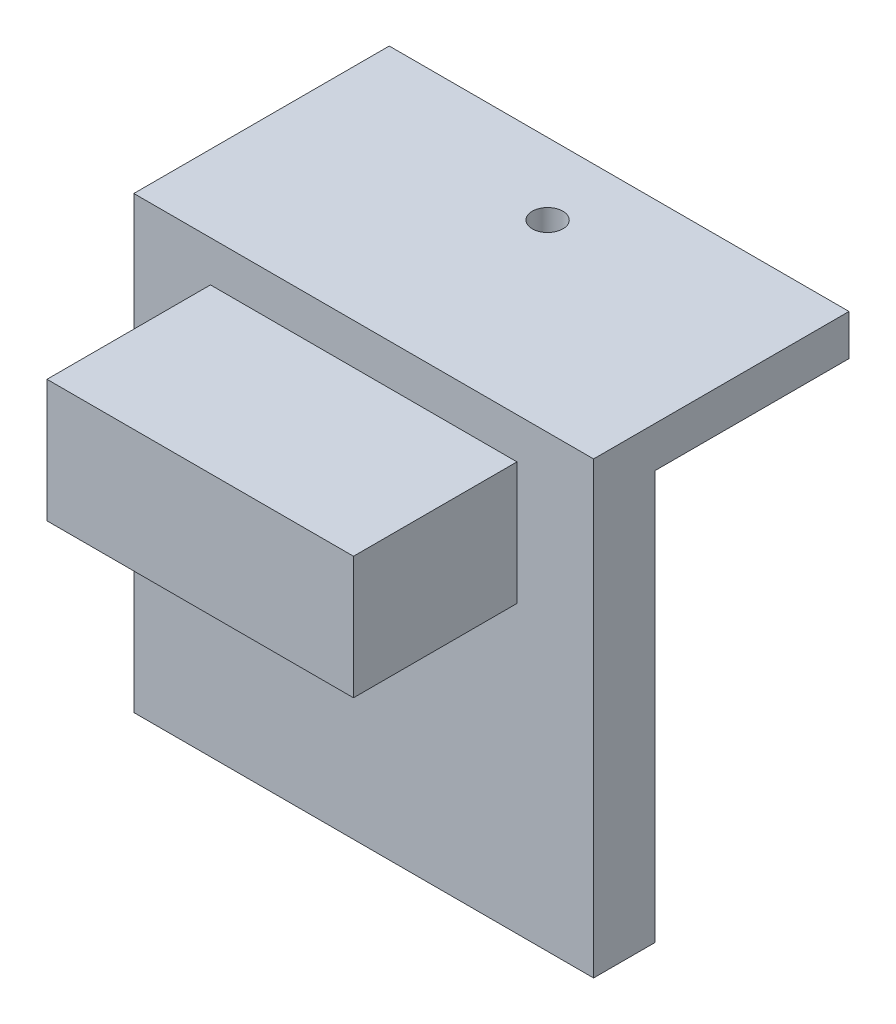
ISO-10303-21;
HEADER;
FILE_DESCRIPTION(('STEP AP214'),'2;1');
FILE_NAME('part.step','',(''),(''),'','','');
FILE_SCHEMA(('AUTOMOTIVE_DESIGN { 1 0 10303 214 1 1 1 1 }'));
ENDSEC;
DATA;
#1=APPLICATION_CONTEXT('core data for automotive mechanical design processes');
#2=APPLICATION_PROTOCOL_DEFINITION('international standard','automotive_design',2000,#1);
#3=PRODUCT_CONTEXT('',#1,'mechanical');
#4=PRODUCT('Part','Part','',(#3));
#5=PRODUCT_RELATED_PRODUCT_CATEGORY('part','',(#4));
#6=PRODUCT_DEFINITION_FORMATION('','',#4);
#7=PRODUCT_DEFINITION_CONTEXT('part definition',#1,'design');
#8=PRODUCT_DEFINITION('design','',#6,#7);
#9=PRODUCT_DEFINITION_SHAPE('','',#8);
#10=(LENGTH_UNIT() NAMED_UNIT(*) SI_UNIT(.MILLI.,.METRE.));
#11=(NAMED_UNIT(*) PLANE_ANGLE_UNIT() SI_UNIT($,.RADIAN.));
#12=(NAMED_UNIT(*) SI_UNIT($,.STERADIAN.) SOLID_ANGLE_UNIT());
#13=UNCERTAINTY_MEASURE_WITH_UNIT(LENGTH_MEASURE(1.E-05),#10,'distance_accuracy_value','');
#14=(GEOMETRIC_REPRESENTATION_CONTEXT(3) GLOBAL_UNCERTAINTY_ASSIGNED_CONTEXT((#13)) GLOBAL_UNIT_ASSIGNED_CONTEXT((#10,
#11,#12)) REPRESENTATION_CONTEXT('',''));
#15=CARTESIAN_POINT('',(0.,0.,0.));
#16=DIRECTION('',(0.,0.,1.));
#17=DIRECTION('',(1.,0.,0.));
#18=AXIS2_PLACEMENT_3D('',#15,#16,#17);
#19=CARTESIAN_POINT('',(-22.5,20.,6.));
#20=DIRECTION('',(0.,-1.,0.));
#21=DIRECTION('',(0.,0.,-1.));
#22=AXIS2_PLACEMENT_3D('',#19,#20,#21);
#23=PLANE('',#22);
#24=DIRECTION('',(1.,0.,0.));
#25=VECTOR('',#24,1.);
#26=CARTESIAN_POINT('',(-22.5,20.,6.));
#27=LINE('',#26,#25);
#28=CARTESIAN_POINT('',(-15.,20.,6.));
#29=VERTEX_POINT('',#28);
#30=CARTESIAN_POINT('',(15.,20.,6.));
#31=VERTEX_POINT('',#30);
#32=EDGE_CURVE('E11',#29,#31,#27,.T.);
#33=ORIENTED_EDGE('',*,*,#32,.F.);
#34=DIRECTION('',(0.,0.,-1.));
#35=VECTOR('',#34,1.);
#36=CARTESIAN_POINT('',(-15.,20.,22.));
#37=LINE('',#36,#35);
#38=CARTESIAN_POINT('',(-15.,20.,22.));
#39=VERTEX_POINT('',#38);
#40=EDGE_CURVE('E181',#39,#29,#37,.T.);
#41=ORIENTED_EDGE('',*,*,#40,.F.);
#42=DIRECTION('',(-1.,0.,0.));
#43=VECTOR('',#42,1.);
#44=CARTESIAN_POINT('',(-15.,20.,22.));
#45=LINE('',#44,#43);
#46=CARTESIAN_POINT('',(15.,20.,22.));
#47=VERTEX_POINT('',#46);
#48=EDGE_CURVE('E184',#47,#39,#45,.T.);
#49=ORIENTED_EDGE('',*,*,#48,.F.);
#50=DIRECTION('',(0.,0.,-1.));
#51=VECTOR('',#50,1.);
#52=CARTESIAN_POINT('',(15.,20.,22.));
#53=LINE('',#52,#51);
#54=EDGE_CURVE('E183',#47,#31,#53,.T.);
#55=ORIENTED_EDGE('',*,*,#54,.T.);
#56=EDGE_LOOP('',(#33,#41,#49,#55));
#57=FACE_BOUND('',#56,.T.);
#58=ADVANCED_FACE('F35',(#57),#23,.F.);
#59=CARTESIAN_POINT('',(22.5,20.,6.));
#60=DIRECTION('',(-1.,0.,0.));
#61=DIRECTION('',(0.,-1.,0.));
#62=AXIS2_PLACEMENT_3D('',#59,#60,#61);
#63=PLANE('',#62);
#64=DIRECTION('',(0.,1.,0.));
#65=VECTOR('',#64,1.);
#66=CARTESIAN_POINT('',(22.5,20.,0.));
#67=LINE('',#66,#65);
#68=CARTESIAN_POINT('',(22.5,-20.,0.));
#69=VERTEX_POINT('',#68);
#70=CARTESIAN_POINT('',(22.5,20.,0.));
#71=VERTEX_POINT('',#70);
#72=EDGE_CURVE('E198',#69,#71,#67,.T.);
#73=ORIENTED_EDGE('',*,*,#72,.T.);
#74=DIRECTION('',(0.,0.,-1.));
#75=VECTOR('',#74,1.);
#76=CARTESIAN_POINT('',(22.5,20.,6.));
#77=LINE('',#76,#75);
#78=CARTESIAN_POINT('',(22.5,20.,-19.));
#79=VERTEX_POINT('',#78);
#80=EDGE_CURVE('E138',#71,#79,#77,.T.);
#81=ORIENTED_EDGE('',*,*,#80,.T.);
#82=DIRECTION('',(0.,-1.,0.));
#83=VECTOR('',#82,1.);
#84=CARTESIAN_POINT('',(22.5,24.,-19.));
#85=LINE('',#84,#83);
#86=CARTESIAN_POINT('',(22.5,24.,-19.));
#87=VERTEX_POINT('',#86);
#88=EDGE_CURVE('E157',#87,#79,#85,.T.);
#89=ORIENTED_EDGE('',*,*,#88,.F.);
#90=DIRECTION('',(0.,0.,-1.));
#91=VECTOR('',#90,1.);
#92=CARTESIAN_POINT('',(22.5,24.,6.));
#93=LINE('',#92,#91);
#94=CARTESIAN_POINT('',(22.5,24.,6.));
#95=VERTEX_POINT('',#94);
#96=EDGE_CURVE('E129',#95,#87,#93,.T.);
#97=ORIENTED_EDGE('',*,*,#96,.F.);
#98=DIRECTION('',(0.,1.,0.));
#99=VECTOR('',#98,1.);
#100=CARTESIAN_POINT('',(22.5,20.,6.));
#101=LINE('',#100,#99);
#102=CARTESIAN_POINT('',(22.5,-20.,6.));
#103=VERTEX_POINT('',#102);
#104=EDGE_CURVE('E121',#103,#95,#101,.T.);
#105=ORIENTED_EDGE('',*,*,#104,.F.);
#106=DIRECTION('',(0.,0.,-1.));
#107=VECTOR('',#106,1.);
#108=CARTESIAN_POINT('',(22.5,-20.,6.));
#109=LINE('',#108,#107);
#110=EDGE_CURVE('E202',#103,#69,#109,.T.);
#111=ORIENTED_EDGE('',*,*,#110,.T.);
#112=EDGE_LOOP('',(#73,#81,#89,#97,#105,#111));
#113=FACE_BOUND('',#112,.T.);
#114=ADVANCED_FACE('F37',(#113),#63,.F.);
#115=CARTESIAN_POINT('',(-22.5,20.,6.));
#116=DIRECTION('',(1.,0.,0.));
#117=DIRECTION('',(0.,1.,0.));
#118=AXIS2_PLACEMENT_3D('',#115,#116,#117);
#119=PLANE('',#118);
#120=DIRECTION('',(0.,-1.,0.));
#121=VECTOR('',#120,1.);
#122=CARTESIAN_POINT('',(-22.5,20.,0.));
#123=LINE('',#122,#121);
#124=CARTESIAN_POINT('',(-22.5,20.,0.));
#125=VERTEX_POINT('',#124);
#126=CARTESIAN_POINT('',(-22.5,-20.,0.));
#127=VERTEX_POINT('',#126);
#128=EDGE_CURVE('E208',#125,#127,#123,.T.);
#129=ORIENTED_EDGE('',*,*,#128,.T.);
#130=DIRECTION('',(0.,0.,-1.));
#131=VECTOR('',#130,1.);
#132=CARTESIAN_POINT('',(-22.5,-20.,6.));
#133=LINE('',#132,#131);
#134=CARTESIAN_POINT('',(-22.5,-20.,6.));
#135=VERTEX_POINT('',#134);
#136=EDGE_CURVE('E44',#135,#127,#133,.T.);
#137=ORIENTED_EDGE('',*,*,#136,.F.);
#138=DIRECTION('',(0.,-1.,0.));
#139=VECTOR('',#138,1.);
#140=CARTESIAN_POINT('',(-22.5,20.,6.));
#141=LINE('',#140,#139);
#142=CARTESIAN_POINT('',(-22.5,24.,6.));
#143=VERTEX_POINT('',#142);
#144=EDGE_CURVE('E111',#143,#135,#141,.T.);
#145=ORIENTED_EDGE('',*,*,#144,.F.);
#146=DIRECTION('',(0.,0.,1.));
#147=VECTOR('',#146,1.);
#148=CARTESIAN_POINT('',(-22.5,24.,6.));
#149=LINE('',#148,#147);
#150=CARTESIAN_POINT('',(-22.5,24.,-19.));
#151=VERTEX_POINT('',#150);
#152=EDGE_CURVE('E116',#151,#143,#149,.T.);
#153=ORIENTED_EDGE('',*,*,#152,.F.);
#154=DIRECTION('',(0.,-1.,0.));
#155=VECTOR('',#154,1.);
#156=CARTESIAN_POINT('',(-22.5,24.,-19.));
#157=LINE('',#156,#155);
#158=CARTESIAN_POINT('',(-22.5,20.,-19.));
#159=VERTEX_POINT('',#158);
#160=EDGE_CURVE('E146',#151,#159,#157,.T.);
#161=ORIENTED_EDGE('',*,*,#160,.T.);
#162=DIRECTION('',(0.,0.,1.));
#163=VECTOR('',#162,1.);
#164=CARTESIAN_POINT('',(-22.5,20.,6.));
#165=LINE('',#164,#163);
#166=EDGE_CURVE('E152',#159,#125,#165,.T.);
#167=ORIENTED_EDGE('',*,*,#166,.T.);
#168=EDGE_LOOP('',(#129,#137,#145,#153,#161,#167));
#169=FACE_BOUND('',#168,.T.);
#170=ADVANCED_FACE('F113',(#169),#119,.F.);
#171=CARTESIAN_POINT('',(-22.5,-20.,6.));
#172=DIRECTION('',(0.,1.,0.));
#173=DIRECTION('',(0.,0.,1.));
#174=AXIS2_PLACEMENT_3D('',#171,#172,#173);
#175=PLANE('',#174);
#176=DIRECTION('',(1.,0.,0.));
#177=VECTOR('',#176,1.);
#178=CARTESIAN_POINT('',(-22.5,-20.,0.));
#179=LINE('',#178,#177);
#180=EDGE_CURVE('E199',#127,#69,#179,.T.);
#181=ORIENTED_EDGE('',*,*,#180,.T.);
#182=ORIENTED_EDGE('',*,*,#110,.F.);
#183=DIRECTION('',(1.,0.,0.));
#184=VECTOR('',#183,1.);
#185=CARTESIAN_POINT('',(-22.5,-20.,6.));
#186=LINE('',#185,#184);
#187=EDGE_CURVE('E120',#135,#103,#186,.T.);
#188=ORIENTED_EDGE('',*,*,#187,.F.);
#189=ORIENTED_EDGE('',*,*,#136,.T.);
#190=EDGE_LOOP('',(#181,#182,#188,#189));
#191=FACE_BOUND('',#190,.T.);
#192=ADVANCED_FACE('F217',(#191),#175,.F.);
#193=CARTESIAN_POINT('',(0.,0.,6.));
#194=DIRECTION('',(0.,0.,1.));
#195=DIRECTION('',(1.,0.,0.));
#196=AXIS2_PLACEMENT_3D('',#193,#194,#195);
#197=PLANE('',#196);
#198=DIRECTION('',(1.,0.,0.));
#199=VECTOR('',#198,1.);
#200=CARTESIAN_POINT('',(-22.5,24.,6.));
#201=LINE('',#200,#199);
#202=EDGE_CURVE('E124',#143,#95,#201,.T.);
#203=ORIENTED_EDGE('',*,*,#202,.F.);
#204=ORIENTED_EDGE('',*,*,#144,.T.);
#205=ORIENTED_EDGE('',*,*,#187,.T.);
#206=ORIENTED_EDGE('',*,*,#104,.T.);
#207=EDGE_LOOP('',(#203,#204,#205,#206));
#208=FACE_BOUND('',#207,.T.);
#209=DIRECTION('',(0.,-1.,0.));
#210=VECTOR('',#209,1.);
#211=CARTESIAN_POINT('',(-15.,20.,6.));
#212=LINE('',#211,#210);
#213=CARTESIAN_POINT('',(-15.,7.99999999999999,6.));
#214=VERTEX_POINT('',#213);
#215=EDGE_CURVE('E165',#29,#214,#212,.T.);
#216=ORIENTED_EDGE('',*,*,#215,.F.);
#217=ORIENTED_EDGE('',*,*,#32,.T.);
#218=DIRECTION('',(0.,1.,0.));
#219=VECTOR('',#218,1.);
#220=CARTESIAN_POINT('',(15.,20.,6.));
#221=LINE('',#220,#219);
#222=CARTESIAN_POINT('',(15.,7.99999999999999,6.));
#223=VERTEX_POINT('',#222);
#224=EDGE_CURVE('E174',#223,#31,#221,.T.);
#225=ORIENTED_EDGE('',*,*,#224,.F.);
#226=DIRECTION('',(1.,0.,0.));
#227=VECTOR('',#226,1.);
#228=CARTESIAN_POINT('',(-15.,7.99999999999999,6.));
#229=LINE('',#228,#227);
#230=EDGE_CURVE('E52',#214,#223,#229,.T.);
#231=ORIENTED_EDGE('',*,*,#230,.F.);
#232=EDGE_LOOP('',(#216,#217,#225,#231));
#233=FACE_BOUND('',#232,.T.);
#234=ADVANCED_FACE('F125',(#208,#233),#197,.T.);
#235=CARTESIAN_POINT('',(0.,0.,0.));
#236=DIRECTION('',(0.,0.,1.));
#237=DIRECTION('',(1.,0.,0.));
#238=AXIS2_PLACEMENT_3D('',#235,#236,#237);
#239=PLANE('',#238);
#240=ORIENTED_EDGE('',*,*,#72,.F.);
#241=ORIENTED_EDGE('',*,*,#180,.F.);
#242=ORIENTED_EDGE('',*,*,#128,.F.);
#243=DIRECTION('',(-1.,0.,0.));
#244=VECTOR('',#243,1.);
#245=CARTESIAN_POINT('',(-22.5,20.,0.));
#246=LINE('',#245,#244);
#247=EDGE_CURVE('E206',#71,#125,#246,.T.);
#248=ORIENTED_EDGE('',*,*,#247,.F.);
#249=EDGE_LOOP('',(#240,#241,#242,#248));
#250=FACE_BOUND('',#249,.T.);
#251=ADVANCED_FACE('F222',(#250),#239,.F.);
#252=CARTESIAN_POINT('',(-15.,20.,22.));
#253=DIRECTION('',(1.,0.,0.));
#254=DIRECTION('',(0.,1.,0.));
#255=AXIS2_PLACEMENT_3D('',#252,#253,#254);
#256=PLANE('',#255);
#257=ORIENTED_EDGE('',*,*,#215,.T.);
#258=DIRECTION('',(0.,0.,-1.));
#259=VECTOR('',#258,1.);
#260=CARTESIAN_POINT('',(-15.,7.99999999999999,22.));
#261=LINE('',#260,#259);
#262=CARTESIAN_POINT('',(-15.,7.99999999999999,22.));
#263=VERTEX_POINT('',#262);
#264=EDGE_CURVE('E196',#263,#214,#261,.T.);
#265=ORIENTED_EDGE('',*,*,#264,.F.);
#266=DIRECTION('',(0.,-1.,0.));
#267=VECTOR('',#266,1.);
#268=CARTESIAN_POINT('',(-15.,20.,22.));
#269=LINE('',#268,#267);
#270=EDGE_CURVE('E160',#39,#263,#269,.T.);
#271=ORIENTED_EDGE('',*,*,#270,.F.);
#272=ORIENTED_EDGE('',*,*,#40,.T.);
#273=EDGE_LOOP('',(#257,#265,#271,#272));
#274=FACE_BOUND('',#273,.T.);
#275=ADVANCED_FACE('F250',(#274),#256,.F.);
#276=CARTESIAN_POINT('',(-15.,7.99999999999999,22.));
#277=DIRECTION('',(0.,1.,0.));
#278=DIRECTION('',(0.,0.,1.));
#279=AXIS2_PLACEMENT_3D('',#276,#277,#278);
#280=PLANE('',#279);
#281=ORIENTED_EDGE('',*,*,#230,.T.);
#282=DIRECTION('',(0.,0.,-1.));
#283=VECTOR('',#282,1.);
#284=CARTESIAN_POINT('',(15.,7.99999999999999,22.));
#285=LINE('',#284,#283);
#286=CARTESIAN_POINT('',(15.,7.99999999999999,22.));
#287=VERTEX_POINT('',#286);
#288=EDGE_CURVE('E193',#287,#223,#285,.T.);
#289=ORIENTED_EDGE('',*,*,#288,.F.);
#290=DIRECTION('',(1.,0.,0.));
#291=VECTOR('',#290,1.);
#292=CARTESIAN_POINT('',(-15.,7.99999999999999,22.));
#293=LINE('',#292,#291);
#294=EDGE_CURVE('E271',#263,#287,#293,.T.);
#295=ORIENTED_EDGE('',*,*,#294,.F.);
#296=ORIENTED_EDGE('',*,*,#264,.T.);
#297=EDGE_LOOP('',(#281,#289,#295,#296));
#298=FACE_BOUND('',#297,.T.);
#299=ADVANCED_FACE('F255',(#298),#280,.F.);
#300=CARTESIAN_POINT('',(15.,20.,22.));
#301=DIRECTION('',(-1.,0.,0.));
#302=DIRECTION('',(0.,-1.,0.));
#303=AXIS2_PLACEMENT_3D('',#300,#301,#302);
#304=PLANE('',#303);
#305=ORIENTED_EDGE('',*,*,#224,.T.);
#306=ORIENTED_EDGE('',*,*,#54,.F.);
#307=DIRECTION('',(0.,1.,0.));
#308=VECTOR('',#307,1.);
#309=CARTESIAN_POINT('',(15.,20.,22.));
#310=LINE('',#309,#308);
#311=EDGE_CURVE('E276',#287,#47,#310,.T.);
#312=ORIENTED_EDGE('',*,*,#311,.F.);
#313=ORIENTED_EDGE('',*,*,#288,.T.);
#314=EDGE_LOOP('',(#305,#306,#312,#313));
#315=FACE_BOUND('',#314,.T.);
#316=ADVANCED_FACE('F258',(#315),#304,.F.);
#317=CARTESIAN_POINT('',(0.,0.,22.));
#318=DIRECTION('',(0.,0.,1.));
#319=DIRECTION('',(1.,0.,0.));
#320=AXIS2_PLACEMENT_3D('',#317,#318,#319);
#321=PLANE('',#320);
#322=ORIENTED_EDGE('',*,*,#270,.T.);
#323=ORIENTED_EDGE('',*,*,#294,.T.);
#324=ORIENTED_EDGE('',*,*,#311,.T.);
#325=ORIENTED_EDGE('',*,*,#48,.T.);
#326=EDGE_LOOP('',(#322,#323,#324,#325));
#327=FACE_BOUND('',#326,.T.);
#328=ADVANCED_FACE('F261',(#327),#321,.T.);
#329=CARTESIAN_POINT('',(0.,24.,0.));
#330=DIRECTION('',(0.,-1.,0.));
#331=DIRECTION('',(0.,0.,-1.));
#332=AXIS2_PLACEMENT_3D('',#329,#330,#331);
#333=PLANE('',#332);
#334=ORIENTED_EDGE('',*,*,#152,.T.);
#335=ORIENTED_EDGE('',*,*,#202,.T.);
#336=ORIENTED_EDGE('',*,*,#96,.T.);
#337=DIRECTION('',(-1.,0.,0.));
#338=VECTOR('',#337,1.);
#339=CARTESIAN_POINT('',(-22.5,24.,-19.));
#340=LINE('',#339,#338);
#341=EDGE_CURVE('E134',#87,#151,#340,.T.);
#342=ORIENTED_EDGE('',*,*,#341,.T.);
#343=EDGE_LOOP('',(#334,#335,#336,#342));
#344=FACE_BOUND('',#343,.T.);
#345=CARTESIAN_POINT('',(0.,24.,-12.));
#346=DIRECTION('',(0.,1.,0.));
#347=DIRECTION('',(0.,0.,1.));
#348=AXIS2_PLACEMENT_3D('',#345,#346,#347);
#349=CIRCLE('',#348,1.5);
#350=CARTESIAN_POINT('',(0.,24.,-10.5));
#351=VERTEX_POINT('',#350);
#352=EDGE_CURVE('E156',#351,#351,#349,.T.);
#353=ORIENTED_EDGE('',*,*,#352,.F.);
#354=EDGE_LOOP('',(#353));
#355=FACE_BOUND('',#354,.T.);
#356=ADVANCED_FACE('F131',(#344,#355),#333,.F.);
#357=CARTESIAN_POINT('',(0.,20.,0.));
#358=DIRECTION('',(0.,-1.,0.));
#359=DIRECTION('',(0.,0.,-1.));
#360=AXIS2_PLACEMENT_3D('',#357,#358,#359);
#361=PLANE('',#360);
#362=ORIENTED_EDGE('',*,*,#80,.F.);
#363=ORIENTED_EDGE('',*,*,#247,.T.);
#364=ORIENTED_EDGE('',*,*,#166,.F.);
#365=DIRECTION('',(-1.,0.,0.));
#366=VECTOR('',#365,1.);
#367=CARTESIAN_POINT('',(-22.5,20.,-19.));
#368=LINE('',#367,#366);
#369=EDGE_CURVE('E136',#79,#159,#368,.T.);
#370=ORIENTED_EDGE('',*,*,#369,.F.);
#371=EDGE_LOOP('',(#362,#363,#364,#370));
#372=FACE_BOUND('',#371,.T.);
#373=CARTESIAN_POINT('',(0.,20.,-12.));
#374=DIRECTION('',(0.,1.,0.));
#375=DIRECTION('',(0.,0.,1.));
#376=AXIS2_PLACEMENT_3D('',#373,#374,#375);
#377=CIRCLE('',#376,1.5);
#378=CARTESIAN_POINT('',(0.,20.,-10.5));
#379=VERTEX_POINT('',#378);
#380=EDGE_CURVE('E141',#379,#379,#377,.T.);
#381=ORIENTED_EDGE('',*,*,#380,.T.);
#382=EDGE_LOOP('',(#381));
#383=FACE_BOUND('',#382,.T.);
#384=ADVANCED_FACE('F224',(#372,#383),#361,.T.);
#385=CARTESIAN_POINT('',(-22.5,24.,-19.));
#386=DIRECTION('',(0.,0.,1.));
#387=DIRECTION('',(1.,0.,0.));
#388=AXIS2_PLACEMENT_3D('',#385,#386,#387);
#389=PLANE('',#388);
#390=ORIENTED_EDGE('',*,*,#369,.T.);
#391=ORIENTED_EDGE('',*,*,#160,.F.);
#392=ORIENTED_EDGE('',*,*,#341,.F.);
#393=ORIENTED_EDGE('',*,*,#88,.T.);
#394=EDGE_LOOP('',(#390,#391,#392,#393));
#395=FACE_BOUND('',#394,.T.);
#396=ADVANCED_FACE('F226',(#395),#389,.F.);
#397=CARTESIAN_POINT('',(0.,24.,-12.));
#398=DIRECTION('',(0.,-1.,0.));
#399=DIRECTION('',(0.,0.,-1.));
#400=AXIS2_PLACEMENT_3D('',#397,#398,#399);
#401=CYLINDRICAL_SURFACE('',#400,1.5);
#402=ORIENTED_EDGE('',*,*,#352,.T.);
#403=EDGE_LOOP('',(#402));
#404=FACE_BOUND('',#403,.T.);
#405=ORIENTED_EDGE('',*,*,#380,.F.);
#406=EDGE_LOOP('',(#405));
#407=FACE_BOUND('',#406,.T.);
#408=ADVANCED_FACE('F228',(#404,#407),#401,.F.);
#409=CLOSED_SHELL('',(#58,#114,#170,#192,#234,#251,#275,#299,#316,#328,#356,#384,#396,#408));
#410=MANIFOLD_SOLID_BREP('B2',#409);
#411=ADVANCED_BREP_SHAPE_REPRESENTATION('',(#18,#410),#14);
#412=SHAPE_DEFINITION_REPRESENTATION(#9,#411);
ENDSEC;
END-ISO-10303-21;
